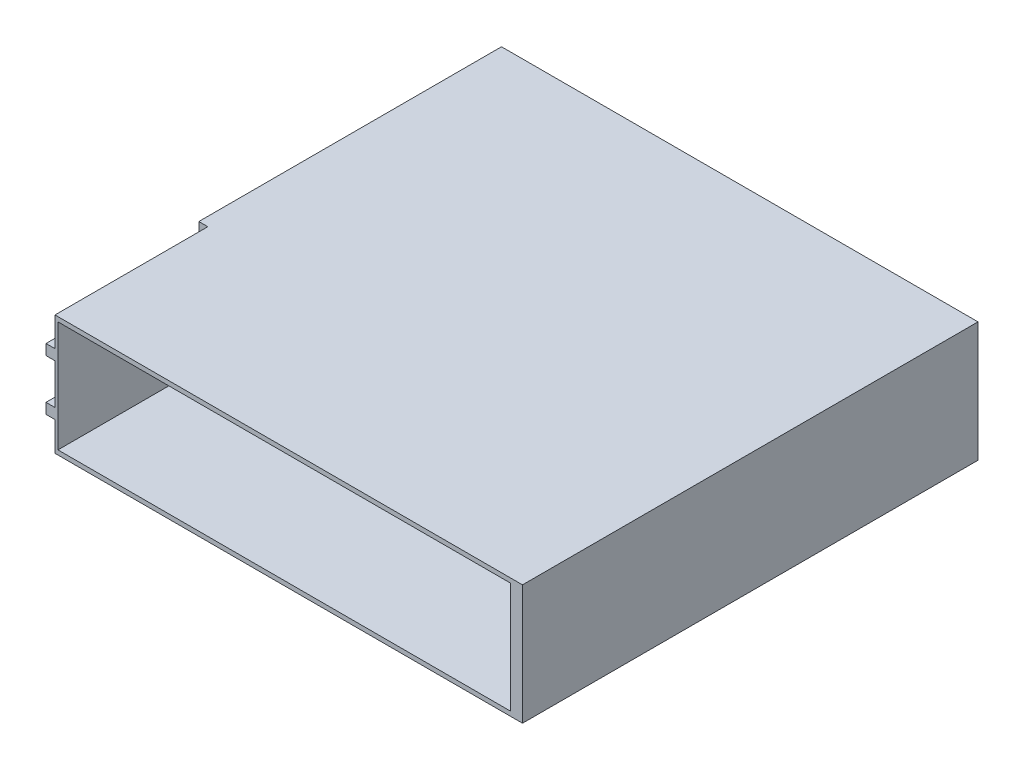
ISO-10303-21;
HEADER;
FILE_DESCRIPTION(('STEP AP214'),'2;1');
FILE_NAME('part.step','',(''),(''),'','','');
FILE_SCHEMA(('AUTOMOTIVE_DESIGN { 1 0 10303 214 1 1 1 1 }'));
ENDSEC;
DATA;
#1=APPLICATION_CONTEXT('core data for automotive mechanical design processes');
#2=APPLICATION_PROTOCOL_DEFINITION('international standard','automotive_design',2000,#1);
#3=PRODUCT_CONTEXT('',#1,'mechanical');
#4=PRODUCT('Part','Part','',(#3));
#5=PRODUCT_RELATED_PRODUCT_CATEGORY('part','',(#4));
#6=PRODUCT_DEFINITION_FORMATION('','',#4);
#7=PRODUCT_DEFINITION_CONTEXT('part definition',#1,'design');
#8=PRODUCT_DEFINITION('design','',#6,#7);
#9=PRODUCT_DEFINITION_SHAPE('','',#8);
#10=(LENGTH_UNIT() NAMED_UNIT(*) SI_UNIT(.MILLI.,.METRE.));
#11=(NAMED_UNIT(*) PLANE_ANGLE_UNIT() SI_UNIT($,.RADIAN.));
#12=(NAMED_UNIT(*) SI_UNIT($,.STERADIAN.) SOLID_ANGLE_UNIT());
#13=UNCERTAINTY_MEASURE_WITH_UNIT(LENGTH_MEASURE(1.E-05),#10,'distance_accuracy_value','');
#14=(GEOMETRIC_REPRESENTATION_CONTEXT(3) GLOBAL_UNCERTAINTY_ASSIGNED_CONTEXT((#13)) GLOBAL_UNIT_ASSIGNED_CONTEXT((#10,
#11,#12)) REPRESENTATION_CONTEXT('',''));
#15=CARTESIAN_POINT('',(0.,0.,0.));
#16=DIRECTION('',(0.,0.,1.));
#17=DIRECTION('',(1.,0.,0.));
#18=AXIS2_PLACEMENT_3D('',#15,#16,#17);
#19=CARTESIAN_POINT('',(0.,0.,2.));
#20=DIRECTION('',(1.,0.,0.));
#21=DIRECTION('',(0.,0.,-1.));
#22=AXIS2_PLACEMENT_3D('',#19,#20,#21);
#23=PLANE('',#22);
#24=DIRECTION('',(0.,0.,1.));
#25=VECTOR('',#24,1.);
#26=CARTESIAN_POINT('',(0.,9.74999999999999,0.));
#27=LINE('',#26,#25);
#28=CARTESIAN_POINT('',(0.,9.74999999999999,101.));
#29=VERTEX_POINT('',#28);
#30=CARTESIAN_POINT('',(0.,9.74999999999999,152.));
#31=VERTEX_POINT('',#30);
#32=EDGE_CURVE('E163',#29,#31,#27,.T.);
#33=ORIENTED_EDGE('',*,*,#32,.T.);
#34=DIRECTION('',(0.,-1.,0.));
#35=VECTOR('',#34,1.);
#36=CARTESIAN_POINT('',(0.,40.,152.));
#37=LINE('',#36,#35);
#38=CARTESIAN_POINT('',(0.,13.25,152.));
#39=VERTEX_POINT('',#38);
#40=EDGE_CURVE('E263',#39,#31,#37,.T.);
#41=ORIENTED_EDGE('',*,*,#40,.F.);
#42=DIRECTION('',(0.,0.,1.));
#43=VECTOR('',#42,1.);
#44=CARTESIAN_POINT('',(0.,13.25,0.));
#45=LINE('',#44,#43);
#46=CARTESIAN_POINT('',(0.,13.25,101.));
#47=VERTEX_POINT('',#46);
#48=EDGE_CURVE('E199',#47,#39,#45,.T.);
#49=ORIENTED_EDGE('',*,*,#48,.F.);
#50=DIRECTION('',(0.,-1.,0.));
#51=VECTOR('',#50,1.);
#52=CARTESIAN_POINT('',(0.,0.,101.));
#53=LINE('',#52,#51);
#54=CARTESIAN_POINT('',(0.,26.75,101.));
#55=VERTEX_POINT('',#54);
#56=EDGE_CURVE('E186',#55,#47,#53,.T.);
#57=ORIENTED_EDGE('',*,*,#56,.F.);
#58=DIRECTION('',(0.,0.,1.));
#59=VECTOR('',#58,1.);
#60=CARTESIAN_POINT('',(0.,26.75,0.));
#61=LINE('',#60,#59);
#62=CARTESIAN_POINT('',(0.,26.75,152.));
#63=VERTEX_POINT('',#62);
#64=EDGE_CURVE('E190',#55,#63,#61,.T.);
#65=ORIENTED_EDGE('',*,*,#64,.T.);
#66=CARTESIAN_POINT('',(0.,30.25,152.));
#67=VERTEX_POINT('',#66);
#68=EDGE_CURVE('E264',#67,#63,#37,.T.);
#69=ORIENTED_EDGE('',*,*,#68,.F.);
#70=DIRECTION('',(0.,0.,1.));
#71=VECTOR('',#70,1.);
#72=CARTESIAN_POINT('',(0.,30.25,0.));
#73=LINE('',#72,#71);
#74=CARTESIAN_POINT('',(0.,30.25,101.));
#75=VERTEX_POINT('',#74);
#76=EDGE_CURVE('E216',#75,#67,#73,.T.);
#77=ORIENTED_EDGE('',*,*,#76,.F.);
#78=DIRECTION('',(0.,-1.,0.));
#79=VECTOR('',#78,1.);
#80=CARTESIAN_POINT('',(0.,0.,101.));
#81=LINE('',#80,#79);
#82=CARTESIAN_POINT('',(0.,40.,101.));
#83=VERTEX_POINT('',#82);
#84=EDGE_CURVE('E205',#83,#75,#81,.T.);
#85=ORIENTED_EDGE('',*,*,#84,.F.);
#86=DIRECTION('',(0.,0.,-1.));
#87=VECTOR('',#86,1.);
#88=CARTESIAN_POINT('',(0.,40.,2.));
#89=LINE('',#88,#87);
#90=CARTESIAN_POINT('',(0.,40.,0.));
#91=VERTEX_POINT('',#90);
#92=EDGE_CURVE('E285',#83,#91,#89,.T.);
#93=ORIENTED_EDGE('',*,*,#92,.T.);
#94=DIRECTION('',(0.,-1.,0.));
#95=VECTOR('',#94,1.);
#96=CARTESIAN_POINT('',(0.,0.,0.));
#97=LINE('',#96,#95);
#98=CARTESIAN_POINT('',(0.,0.,0.));
#99=VERTEX_POINT('',#98);
#100=EDGE_CURVE('E275',#91,#99,#97,.T.);
#101=ORIENTED_EDGE('',*,*,#100,.T.);
#102=DIRECTION('',(0.,0.,-1.));
#103=VECTOR('',#102,1.);
#104=CARTESIAN_POINT('',(0.,0.,2.));
#105=LINE('',#104,#103);
#106=CARTESIAN_POINT('',(0.,0.,101.));
#107=VERTEX_POINT('',#106);
#108=EDGE_CURVE('E11',#107,#99,#105,.T.);
#109=ORIENTED_EDGE('',*,*,#108,.F.);
#110=DIRECTION('',(0.,-1.,0.));
#111=VECTOR('',#110,1.);
#112=CARTESIAN_POINT('',(0.,0.,101.));
#113=LINE('',#112,#111);
#114=EDGE_CURVE('E172',#29,#107,#113,.T.);
#115=ORIENTED_EDGE('',*,*,#114,.F.);
#116=EDGE_LOOP('',(#33,#41,#49,#57,#65,#69,#77,#85,#93,#101,#109,#115));
#117=FACE_BOUND('',#116,.T.);
#118=ADVANCED_FACE('F33',(#117),#23,.F.);
#119=CARTESIAN_POINT('',(0.,0.,152.));
#120=DIRECTION('',(0.,0.,1.));
#121=DIRECTION('',(1.,0.,0.));
#122=AXIS2_PLACEMENT_3D('',#119,#120,#121);
#123=PLANE('',#122);
#124=DIRECTION('',(1.,0.,0.));
#125=VECTOR('',#124,1.);
#126=CARTESIAN_POINT('',(4.,1.5,152.));
#127=LINE('',#126,#125);
#128=CARTESIAN_POINT('',(4.,1.5,152.));
#129=VERTEX_POINT('',#128);
#130=CARTESIAN_POINT('',(155.,1.5,152.));
#131=VERTEX_POINT('',#130);
#132=EDGE_CURVE('E236',#129,#131,#127,.T.);
#133=ORIENTED_EDGE('',*,*,#132,.F.);
#134=DIRECTION('',(0.,-1.,0.));
#135=VECTOR('',#134,1.);
#136=CARTESIAN_POINT('',(4.,38.5,152.));
#137=LINE('',#136,#135);
#138=CARTESIAN_POINT('',(4.,38.5,152.));
#139=VERTEX_POINT('',#138);
#140=EDGE_CURVE('E234',#139,#129,#137,.T.);
#141=ORIENTED_EDGE('',*,*,#140,.F.);
#142=DIRECTION('',(-1.,0.,0.));
#143=VECTOR('',#142,1.);
#144=CARTESIAN_POINT('',(4.,38.5,152.));
#145=LINE('',#144,#143);
#146=CARTESIAN_POINT('',(155.,38.5,152.));
#147=VERTEX_POINT('',#146);
#148=EDGE_CURVE('E242',#147,#139,#145,.T.);
#149=ORIENTED_EDGE('',*,*,#148,.F.);
#150=DIRECTION('',(0.,1.,0.));
#151=VECTOR('',#150,1.);
#152=CARTESIAN_POINT('',(155.,38.5,152.));
#153=LINE('',#152,#151);
#154=EDGE_CURVE('E239',#131,#147,#153,.T.);
#155=ORIENTED_EDGE('',*,*,#154,.F.);
#156=EDGE_LOOP('',(#133,#141,#149,#155));
#157=FACE_BOUND('',#156,.T.);
#158=ORIENTED_EDGE('',*,*,#40,.T.);
#159=DIRECTION('',(-1.,0.,0.));
#160=VECTOR('',#159,1.);
#161=CARTESIAN_POINT('',(3.,9.74999999999999,152.));
#162=LINE('',#161,#160);
#163=CARTESIAN_POINT('',(3.,9.74999999999999,152.));
#164=VERTEX_POINT('',#163);
#165=EDGE_CURVE('E184',#164,#31,#162,.T.);
#166=ORIENTED_EDGE('',*,*,#165,.F.);
#167=DIRECTION('',(0.,1.,0.));
#168=VECTOR('',#167,1.);
#169=CARTESIAN_POINT('',(3.,0.,152.));
#170=LINE('',#169,#168);
#171=CARTESIAN_POINT('',(3.,0.,152.));
#172=VERTEX_POINT('',#171);
#173=EDGE_CURVE('E167',#172,#164,#170,.T.);
#174=ORIENTED_EDGE('',*,*,#173,.F.);
#175=DIRECTION('',(1.,0.,0.));
#176=VECTOR('',#175,1.);
#177=CARTESIAN_POINT('',(0.,0.,152.));
#178=LINE('',#177,#176);
#179=CARTESIAN_POINT('',(159.,0.,152.));
#180=VERTEX_POINT('',#179);
#181=EDGE_CURVE('E267',#172,#180,#178,.T.);
#182=ORIENTED_EDGE('',*,*,#181,.T.);
#183=DIRECTION('',(0.,1.,0.));
#184=VECTOR('',#183,1.);
#185=CARTESIAN_POINT('',(159.,40.,152.));
#186=LINE('',#185,#184);
#187=CARTESIAN_POINT('',(159.,40.,152.));
#188=VERTEX_POINT('',#187);
#189=EDGE_CURVE('E269',#180,#188,#186,.T.);
#190=ORIENTED_EDGE('',*,*,#189,.T.);
#191=DIRECTION('',(-1.,0.,0.));
#192=VECTOR('',#191,1.);
#193=CARTESIAN_POINT('',(0.,40.,152.));
#194=LINE('',#193,#192);
#195=CARTESIAN_POINT('',(3.,40.,152.));
#196=VERTEX_POINT('',#195);
#197=EDGE_CURVE('E272',#188,#196,#194,.T.);
#198=ORIENTED_EDGE('',*,*,#197,.T.);
#199=DIRECTION('',(0.,1.,0.));
#200=VECTOR('',#199,1.);
#201=CARTESIAN_POINT('',(3.,0.,152.));
#202=LINE('',#201,#200);
#203=CARTESIAN_POINT('',(3.,30.25,152.));
#204=VERTEX_POINT('',#203);
#205=EDGE_CURVE('E218',#204,#196,#202,.T.);
#206=ORIENTED_EDGE('',*,*,#205,.F.);
#207=DIRECTION('',(-1.,0.,0.));
#208=VECTOR('',#207,1.);
#209=CARTESIAN_POINT('',(3.,30.25,152.));
#210=LINE('',#209,#208);
#211=EDGE_CURVE('E230',#204,#67,#210,.T.);
#212=ORIENTED_EDGE('',*,*,#211,.T.);
#213=ORIENTED_EDGE('',*,*,#68,.T.);
#214=DIRECTION('',(-1.,0.,0.));
#215=VECTOR('',#214,1.);
#216=CARTESIAN_POINT('',(3.,26.75,152.));
#217=LINE('',#216,#215);
#218=CARTESIAN_POINT('',(3.,26.75,152.));
#219=VERTEX_POINT('',#218);
#220=EDGE_CURVE('E206',#219,#63,#217,.T.);
#221=ORIENTED_EDGE('',*,*,#220,.F.);
#222=DIRECTION('',(0.,1.,0.));
#223=VECTOR('',#222,1.);
#224=CARTESIAN_POINT('',(3.,0.,152.));
#225=LINE('',#224,#223);
#226=CARTESIAN_POINT('',(3.,13.25,152.));
#227=VERTEX_POINT('',#226);
#228=EDGE_CURVE('E192',#227,#219,#225,.T.);
#229=ORIENTED_EDGE('',*,*,#228,.F.);
#230=DIRECTION('',(-1.,0.,0.));
#231=VECTOR('',#230,1.);
#232=CARTESIAN_POINT('',(3.,13.25,152.));
#233=LINE('',#232,#231);
#234=EDGE_CURVE('E208',#227,#39,#233,.T.);
#235=ORIENTED_EDGE('',*,*,#234,.T.);
#236=EDGE_LOOP('',(#158,#166,#174,#182,#190,#198,#206,#212,#213,#221,#229,#235));
#237=FACE_BOUND('',#236,.T.);
#238=ADVANCED_FACE('F310',(#157,#237),#123,.T.);
#239=CARTESIAN_POINT('',(0.,0.,2.));
#240=DIRECTION('',(0.,1.,0.));
#241=DIRECTION('',(0.,0.,1.));
#242=AXIS2_PLACEMENT_3D('',#239,#240,#241);
#243=PLANE('',#242);
#244=DIRECTION('',(0.,0.,1.));
#245=VECTOR('',#244,1.);
#246=CARTESIAN_POINT('',(3.,0.,0.));
#247=LINE('',#246,#245);
#248=CARTESIAN_POINT('',(3.,0.,101.));
#249=VERTEX_POINT('',#248);
#250=EDGE_CURVE('E177',#249,#172,#247,.T.);
#251=ORIENTED_EDGE('',*,*,#250,.F.);
#252=DIRECTION('',(-1.,0.,0.));
#253=VECTOR('',#252,1.);
#254=CARTESIAN_POINT('',(3.,0.,101.));
#255=LINE('',#254,#253);
#256=EDGE_CURVE('E166',#249,#107,#255,.T.);
#257=ORIENTED_EDGE('',*,*,#256,.T.);
#258=ORIENTED_EDGE('',*,*,#108,.T.);
#259=DIRECTION('',(1.,0.,0.));
#260=VECTOR('',#259,1.);
#261=CARTESIAN_POINT('',(0.,0.,0.));
#262=LINE('',#261,#260);
#263=CARTESIAN_POINT('',(159.,0.,0.));
#264=VERTEX_POINT('',#263);
#265=EDGE_CURVE('E278',#99,#264,#262,.T.);
#266=ORIENTED_EDGE('',*,*,#265,.T.);
#267=DIRECTION('',(0.,0.,-1.));
#268=VECTOR('',#267,1.);
#269=CARTESIAN_POINT('',(159.,0.,2.));
#270=LINE('',#269,#268);
#271=EDGE_CURVE('E40',#180,#264,#270,.T.);
#272=ORIENTED_EDGE('',*,*,#271,.F.);
#273=ORIENTED_EDGE('',*,*,#181,.F.);
#274=EDGE_LOOP('',(#251,#257,#258,#266,#272,#273));
#275=FACE_BOUND('',#274,.T.);
#276=ADVANCED_FACE('F312',(#275),#243,.F.);
#277=CARTESIAN_POINT('',(159.,0.,2.));
#278=DIRECTION('',(-1.,0.,0.));
#279=DIRECTION('',(0.,0.,1.));
#280=AXIS2_PLACEMENT_3D('',#277,#278,#279);
#281=PLANE('',#280);
#282=DIRECTION('',(0.,1.,0.));
#283=VECTOR('',#282,1.);
#284=CARTESIAN_POINT('',(159.,0.,0.));
#285=LINE('',#284,#283);
#286=CARTESIAN_POINT('',(159.,40.,0.));
#287=VERTEX_POINT('',#286);
#288=EDGE_CURVE('E280',#264,#287,#285,.T.);
#289=ORIENTED_EDGE('',*,*,#288,.T.);
#290=DIRECTION('',(0.,0.,-1.));
#291=VECTOR('',#290,1.);
#292=CARTESIAN_POINT('',(159.,40.,2.));
#293=LINE('',#292,#291);
#294=EDGE_CURVE('E287',#188,#287,#293,.T.);
#295=ORIENTED_EDGE('',*,*,#294,.F.);
#296=ORIENTED_EDGE('',*,*,#189,.F.);
#297=ORIENTED_EDGE('',*,*,#271,.T.);
#298=EDGE_LOOP('',(#289,#295,#296,#297));
#299=FACE_BOUND('',#298,.T.);
#300=ADVANCED_FACE('F294',(#299),#281,.F.);
#301=CARTESIAN_POINT('',(0.,40.,2.));
#302=DIRECTION('',(0.,-1.,0.));
#303=DIRECTION('',(0.,0.,-1.));
#304=AXIS2_PLACEMENT_3D('',#301,#302,#303);
#305=PLANE('',#304);
#306=ORIENTED_EDGE('',*,*,#92,.F.);
#307=DIRECTION('',(-1.,0.,0.));
#308=VECTOR('',#307,1.);
#309=CARTESIAN_POINT('',(3.,40.,101.));
#310=LINE('',#309,#308);
#311=CARTESIAN_POINT('',(3.,40.,101.));
#312=VERTEX_POINT('',#311);
#313=EDGE_CURVE('E227',#312,#83,#310,.T.);
#314=ORIENTED_EDGE('',*,*,#313,.F.);
#315=DIRECTION('',(0.,0.,-1.));
#316=VECTOR('',#315,1.);
#317=CARTESIAN_POINT('',(3.,40.,0.));
#318=LINE('',#317,#316);
#319=EDGE_CURVE('E220',#196,#312,#318,.T.);
#320=ORIENTED_EDGE('',*,*,#319,.F.);
#321=ORIENTED_EDGE('',*,*,#197,.F.);
#322=ORIENTED_EDGE('',*,*,#294,.T.);
#323=DIRECTION('',(-1.,0.,0.));
#324=VECTOR('',#323,1.);
#325=CARTESIAN_POINT('',(0.,40.,0.));
#326=LINE('',#325,#324);
#327=EDGE_CURVE('E282',#287,#91,#326,.T.);
#328=ORIENTED_EDGE('',*,*,#327,.T.);
#329=EDGE_LOOP('',(#306,#314,#320,#321,#322,#328));
#330=FACE_BOUND('',#329,.T.);
#331=ADVANCED_FACE('F304',(#330),#305,.F.);
#332=CARTESIAN_POINT('',(0.,0.,0.));
#333=DIRECTION('',(0.,0.,-1.));
#334=DIRECTION('',(-1.,0.,0.));
#335=AXIS2_PLACEMENT_3D('',#332,#333,#334);
#336=PLANE('',#335);
#337=ORIENTED_EDGE('',*,*,#100,.F.);
#338=ORIENTED_EDGE('',*,*,#327,.F.);
#339=ORIENTED_EDGE('',*,*,#288,.F.);
#340=ORIENTED_EDGE('',*,*,#265,.F.);
#341=EDGE_LOOP('',(#337,#338,#339,#340));
#342=FACE_BOUND('',#341,.T.);
#343=ADVANCED_FACE('F301',(#342),#336,.T.);
#344=CARTESIAN_POINT('',(4.,38.5,152.));
#345=DIRECTION('',(1.,0.,0.));
#346=DIRECTION('',(0.,1.,0.));
#347=AXIS2_PLACEMENT_3D('',#344,#345,#346);
#348=PLANE('',#347);
#349=DIRECTION('',(0.,-1.,0.));
#350=VECTOR('',#349,1.);
#351=CARTESIAN_POINT('',(4.,38.5,2.));
#352=LINE('',#351,#350);
#353=CARTESIAN_POINT('',(4.,38.5,2.));
#354=VERTEX_POINT('',#353);
#355=CARTESIAN_POINT('',(4.,1.5,2.));
#356=VERTEX_POINT('',#355);
#357=EDGE_CURVE('E229',#354,#356,#352,.T.);
#358=ORIENTED_EDGE('',*,*,#357,.F.);
#359=DIRECTION('',(0.,0.,-1.));
#360=VECTOR('',#359,1.);
#361=CARTESIAN_POINT('',(4.,38.5,152.));
#362=LINE('',#361,#360);
#363=EDGE_CURVE('E244',#139,#354,#362,.T.);
#364=ORIENTED_EDGE('',*,*,#363,.F.);
#365=ORIENTED_EDGE('',*,*,#140,.T.);
#366=DIRECTION('',(0.,0.,-1.));
#367=VECTOR('',#366,1.);
#368=CARTESIAN_POINT('',(4.,1.5,152.));
#369=LINE('',#368,#367);
#370=EDGE_CURVE('E260',#129,#356,#369,.T.);
#371=ORIENTED_EDGE('',*,*,#370,.T.);
#372=EDGE_LOOP('',(#358,#364,#365,#371));
#373=FACE_BOUND('',#372,.T.);
#374=ADVANCED_FACE('F361',(#373),#348,.T.);
#375=CARTESIAN_POINT('',(4.,1.5,152.));
#376=DIRECTION('',(0.,1.,0.));
#377=DIRECTION('',(0.,0.,1.));
#378=AXIS2_PLACEMENT_3D('',#375,#376,#377);
#379=PLANE('',#378);
#380=DIRECTION('',(1.,0.,0.));
#381=VECTOR('',#380,1.);
#382=CARTESIAN_POINT('',(4.,1.5,2.));
#383=LINE('',#382,#381);
#384=CARTESIAN_POINT('',(155.,1.5,2.));
#385=VERTEX_POINT('',#384);
#386=EDGE_CURVE('E247',#356,#385,#383,.T.);
#387=ORIENTED_EDGE('',*,*,#386,.F.);
#388=ORIENTED_EDGE('',*,*,#370,.F.);
#389=ORIENTED_EDGE('',*,*,#132,.T.);
#390=DIRECTION('',(0.,0.,-1.));
#391=VECTOR('',#390,1.);
#392=CARTESIAN_POINT('',(155.,1.5,152.));
#393=LINE('',#392,#391);
#394=EDGE_CURVE('E258',#131,#385,#393,.T.);
#395=ORIENTED_EDGE('',*,*,#394,.T.);
#396=EDGE_LOOP('',(#387,#388,#389,#395));
#397=FACE_BOUND('',#396,.T.);
#398=ADVANCED_FACE('F392',(#397),#379,.T.);
#399=CARTESIAN_POINT('',(155.,38.5,152.));
#400=DIRECTION('',(-1.,0.,0.));
#401=DIRECTION('',(0.,0.,1.));
#402=AXIS2_PLACEMENT_3D('',#399,#400,#401);
#403=PLANE('',#402);
#404=DIRECTION('',(0.,1.,0.));
#405=VECTOR('',#404,1.);
#406=CARTESIAN_POINT('',(155.,38.5,2.));
#407=LINE('',#406,#405);
#408=CARTESIAN_POINT('',(155.,38.5,2.));
#409=VERTEX_POINT('',#408);
#410=EDGE_CURVE('E250',#385,#409,#407,.T.);
#411=ORIENTED_EDGE('',*,*,#410,.F.);
#412=ORIENTED_EDGE('',*,*,#394,.F.);
#413=ORIENTED_EDGE('',*,*,#154,.T.);
#414=DIRECTION('',(0.,0.,-1.));
#415=VECTOR('',#414,1.);
#416=CARTESIAN_POINT('',(155.,38.5,152.));
#417=LINE('',#416,#415);
#418=EDGE_CURVE('E256',#147,#409,#417,.T.);
#419=ORIENTED_EDGE('',*,*,#418,.T.);
#420=EDGE_LOOP('',(#411,#412,#413,#419));
#421=FACE_BOUND('',#420,.T.);
#422=ADVANCED_FACE('F399',(#421),#403,.T.);
#423=CARTESIAN_POINT('',(4.,38.5,152.));
#424=DIRECTION('',(0.,-1.,0.));
#425=DIRECTION('',(0.,0.,-1.));
#426=AXIS2_PLACEMENT_3D('',#423,#424,#425);
#427=PLANE('',#426);
#428=DIRECTION('',(-1.,0.,0.));
#429=VECTOR('',#428,1.);
#430=CARTESIAN_POINT('',(4.,38.5,2.));
#431=LINE('',#430,#429);
#432=EDGE_CURVE('E237',#409,#354,#431,.T.);
#433=ORIENTED_EDGE('',*,*,#432,.F.);
#434=ORIENTED_EDGE('',*,*,#418,.F.);
#435=ORIENTED_EDGE('',*,*,#148,.T.);
#436=ORIENTED_EDGE('',*,*,#363,.T.);
#437=EDGE_LOOP('',(#433,#434,#435,#436));
#438=FACE_BOUND('',#437,.T.);
#439=ADVANCED_FACE('F366',(#438),#427,.T.);
#440=CARTESIAN_POINT('',(0.,0.,2.));
#441=DIRECTION('',(0.,0.,-1.));
#442=DIRECTION('',(-1.,0.,0.));
#443=AXIS2_PLACEMENT_3D('',#440,#441,#442);
#444=PLANE('',#443);
#445=ORIENTED_EDGE('',*,*,#432,.T.);
#446=ORIENTED_EDGE('',*,*,#357,.T.);
#447=ORIENTED_EDGE('',*,*,#386,.T.);
#448=ORIENTED_EDGE('',*,*,#410,.T.);
#449=EDGE_LOOP('',(#445,#446,#447,#448));
#450=FACE_BOUND('',#449,.T.);
#451=ADVANCED_FACE('F363',(#450),#444,.F.);
#452=CARTESIAN_POINT('',(3.,0.,101.));
#453=DIRECTION('',(0.,0.,-1.));
#454=DIRECTION('',(-1.,0.,0.));
#455=AXIS2_PLACEMENT_3D('',#452,#453,#454);
#456=PLANE('',#455);
#457=ORIENTED_EDGE('',*,*,#84,.T.);
#458=DIRECTION('',(-1.,0.,0.));
#459=VECTOR('',#458,1.);
#460=CARTESIAN_POINT('',(3.,30.25,101.));
#461=LINE('',#460,#459);
#462=CARTESIAN_POINT('',(3.,30.25,101.));
#463=VERTEX_POINT('',#462);
#464=EDGE_CURVE('E223',#463,#75,#461,.T.);
#465=ORIENTED_EDGE('',*,*,#464,.F.);
#466=DIRECTION('',(0.,-1.,0.));
#467=VECTOR('',#466,1.);
#468=CARTESIAN_POINT('',(3.,0.,101.));
#469=LINE('',#468,#467);
#470=EDGE_CURVE('E212',#312,#463,#469,.T.);
#471=ORIENTED_EDGE('',*,*,#470,.F.);
#472=ORIENTED_EDGE('',*,*,#313,.T.);
#473=EDGE_LOOP('',(#457,#465,#471,#472));
#474=FACE_BOUND('',#473,.T.);
#475=ADVANCED_FACE('F319',(#474),#456,.F.);
#476=CARTESIAN_POINT('',(3.,30.25,0.));
#477=DIRECTION('',(0.,-1.,0.));
#478=DIRECTION('',(0.,0.,-1.));
#479=AXIS2_PLACEMENT_3D('',#476,#477,#478);
#480=PLANE('',#479);
#481=ORIENTED_EDGE('',*,*,#76,.T.);
#482=ORIENTED_EDGE('',*,*,#211,.F.);
#483=DIRECTION('',(0.,0.,1.));
#484=VECTOR('',#483,1.);
#485=CARTESIAN_POINT('',(3.,30.25,0.));
#486=LINE('',#485,#484);
#487=EDGE_CURVE('E215',#463,#204,#486,.T.);
#488=ORIENTED_EDGE('',*,*,#487,.F.);
#489=ORIENTED_EDGE('',*,*,#464,.T.);
#490=EDGE_LOOP('',(#481,#482,#488,#489));
#491=FACE_BOUND('',#490,.T.);
#492=ADVANCED_FACE('F423',(#491),#480,.F.);
#493=CARTESIAN_POINT('',(3.,0.,0.));
#494=DIRECTION('',(-1.,0.,0.));
#495=DIRECTION('',(0.,0.,1.));
#496=AXIS2_PLACEMENT_3D('',#493,#494,#495);
#497=PLANE('',#496);
#498=ORIENTED_EDGE('',*,*,#470,.T.);
#499=ORIENTED_EDGE('',*,*,#487,.T.);
#500=ORIENTED_EDGE('',*,*,#205,.T.);
#501=ORIENTED_EDGE('',*,*,#319,.T.);
#502=EDGE_LOOP('',(#498,#499,#500,#501));
#503=FACE_BOUND('',#502,.T.);
#504=ADVANCED_FACE('F322',(#503),#497,.T.);
#505=CARTESIAN_POINT('',(3.,0.,101.));
#506=DIRECTION('',(0.,0.,-1.));
#507=DIRECTION('',(-1.,0.,0.));
#508=AXIS2_PLACEMENT_3D('',#505,#506,#507);
#509=PLANE('',#508);
#510=ORIENTED_EDGE('',*,*,#56,.T.);
#511=DIRECTION('',(-1.,0.,0.));
#512=VECTOR('',#511,1.);
#513=CARTESIAN_POINT('',(3.,13.25,101.));
#514=LINE('',#513,#512);
#515=CARTESIAN_POINT('',(3.,13.25,101.));
#516=VERTEX_POINT('',#515);
#517=EDGE_CURVE('E196',#516,#47,#514,.T.);
#518=ORIENTED_EDGE('',*,*,#517,.F.);
#519=DIRECTION('',(0.,-1.,0.));
#520=VECTOR('',#519,1.);
#521=CARTESIAN_POINT('',(3.,0.,101.));
#522=LINE('',#521,#520);
#523=CARTESIAN_POINT('',(3.,26.75,101.));
#524=VERTEX_POINT('',#523);
#525=EDGE_CURVE('E188',#524,#516,#522,.T.);
#526=ORIENTED_EDGE('',*,*,#525,.F.);
#527=DIRECTION('',(-1.,0.,0.));
#528=VECTOR('',#527,1.);
#529=CARTESIAN_POINT('',(3.,26.75,101.));
#530=LINE('',#529,#528);
#531=EDGE_CURVE('E203',#524,#55,#530,.T.);
#532=ORIENTED_EDGE('',*,*,#531,.T.);
#533=EDGE_LOOP('',(#510,#518,#526,#532));
#534=FACE_BOUND('',#533,.T.);
#535=ADVANCED_FACE('F337',(#534),#509,.F.);
#536=CARTESIAN_POINT('',(3.,26.75,0.));
#537=DIRECTION('',(0.,-1.,0.));
#538=DIRECTION('',(0.,0.,-1.));
#539=AXIS2_PLACEMENT_3D('',#536,#537,#538);
#540=PLANE('',#539);
#541=ORIENTED_EDGE('',*,*,#64,.F.);
#542=ORIENTED_EDGE('',*,*,#531,.F.);
#543=DIRECTION('',(0.,0.,1.));
#544=VECTOR('',#543,1.);
#545=CARTESIAN_POINT('',(3.,26.75,0.));
#546=LINE('',#545,#544);
#547=EDGE_CURVE('E194',#524,#219,#546,.T.);
#548=ORIENTED_EDGE('',*,*,#547,.T.);
#549=ORIENTED_EDGE('',*,*,#220,.T.);
#550=EDGE_LOOP('',(#541,#542,#548,#549));
#551=FACE_BOUND('',#550,.T.);
#552=ADVANCED_FACE('F330',(#551),#540,.T.);
#553=CARTESIAN_POINT('',(3.,13.25,0.));
#554=DIRECTION('',(0.,-1.,0.));
#555=DIRECTION('',(0.,0.,-1.));
#556=AXIS2_PLACEMENT_3D('',#553,#554,#555);
#557=PLANE('',#556);
#558=ORIENTED_EDGE('',*,*,#48,.T.);
#559=ORIENTED_EDGE('',*,*,#234,.F.);
#560=DIRECTION('',(0.,0.,1.));
#561=VECTOR('',#560,1.);
#562=CARTESIAN_POINT('',(3.,13.25,0.));
#563=LINE('',#562,#561);
#564=EDGE_CURVE('E55',#516,#227,#563,.T.);
#565=ORIENTED_EDGE('',*,*,#564,.F.);
#566=ORIENTED_EDGE('',*,*,#517,.T.);
#567=EDGE_LOOP('',(#558,#559,#565,#566));
#568=FACE_BOUND('',#567,.T.);
#569=ADVANCED_FACE('F339',(#568),#557,.F.);
#570=CARTESIAN_POINT('',(3.,0.,0.));
#571=DIRECTION('',(-1.,0.,0.));
#572=DIRECTION('',(0.,0.,1.));
#573=AXIS2_PLACEMENT_3D('',#570,#571,#572);
#574=PLANE('',#573);
#575=ORIENTED_EDGE('',*,*,#525,.T.);
#576=ORIENTED_EDGE('',*,*,#564,.T.);
#577=ORIENTED_EDGE('',*,*,#228,.T.);
#578=ORIENTED_EDGE('',*,*,#547,.F.);
#579=EDGE_LOOP('',(#575,#576,#577,#578));
#580=FACE_BOUND('',#579,.T.);
#581=ADVANCED_FACE('F334',(#580),#574,.T.);
#582=CARTESIAN_POINT('',(3.,9.74999999999999,0.));
#583=DIRECTION('',(0.,-1.,0.));
#584=DIRECTION('',(0.,0.,-1.));
#585=AXIS2_PLACEMENT_3D('',#582,#583,#584);
#586=PLANE('',#585);
#587=ORIENTED_EDGE('',*,*,#32,.F.);
#588=DIRECTION('',(-1.,0.,0.));
#589=VECTOR('',#588,1.);
#590=CARTESIAN_POINT('',(3.,9.74999999999999,101.));
#591=LINE('',#590,#589);
#592=CARTESIAN_POINT('',(3.,9.74999999999999,101.));
#593=VERTEX_POINT('',#592);
#594=EDGE_CURVE('E158',#593,#29,#591,.T.);
#595=ORIENTED_EDGE('',*,*,#594,.F.);
#596=DIRECTION('',(0.,0.,1.));
#597=VECTOR('',#596,1.);
#598=CARTESIAN_POINT('',(3.,9.74999999999999,0.));
#599=LINE('',#598,#597);
#600=EDGE_CURVE('E160',#593,#164,#599,.T.);
#601=ORIENTED_EDGE('',*,*,#600,.T.);
#602=ORIENTED_EDGE('',*,*,#165,.T.);
#603=EDGE_LOOP('',(#587,#595,#601,#602));
#604=FACE_BOUND('',#603,.T.);
#605=ADVANCED_FACE('F159',(#604),#586,.T.);
#606=CARTESIAN_POINT('',(3.,0.,101.));
#607=DIRECTION('',(0.,0.,-1.));
#608=DIRECTION('',(-1.,0.,0.));
#609=AXIS2_PLACEMENT_3D('',#606,#607,#608);
#610=PLANE('',#609);
#611=ORIENTED_EDGE('',*,*,#114,.T.);
#612=ORIENTED_EDGE('',*,*,#256,.F.);
#613=DIRECTION('',(0.,-1.,0.));
#614=VECTOR('',#613,1.);
#615=CARTESIAN_POINT('',(3.,0.,101.));
#616=LINE('',#615,#614);
#617=EDGE_CURVE('E47',#593,#249,#616,.T.);
#618=ORIENTED_EDGE('',*,*,#617,.F.);
#619=ORIENTED_EDGE('',*,*,#594,.T.);
#620=EDGE_LOOP('',(#611,#612,#618,#619));
#621=FACE_BOUND('',#620,.T.);
#622=ADVANCED_FACE('F174',(#621),#610,.F.);
#623=CARTESIAN_POINT('',(3.,0.,0.));
#624=DIRECTION('',(-1.,0.,0.));
#625=DIRECTION('',(0.,0.,1.));
#626=AXIS2_PLACEMENT_3D('',#623,#624,#625);
#627=PLANE('',#626);
#628=ORIENTED_EDGE('',*,*,#600,.F.);
#629=ORIENTED_EDGE('',*,*,#617,.T.);
#630=ORIENTED_EDGE('',*,*,#250,.T.);
#631=ORIENTED_EDGE('',*,*,#173,.T.);
#632=EDGE_LOOP('',(#628,#629,#630,#631));
#633=FACE_BOUND('',#632,.T.);
#634=ADVANCED_FACE('F169',(#633),#627,.T.);
#635=CLOSED_SHELL('',(#118,#238,#276,#300,#331,#343,#374,#398,#422,#439,#451,#475,#492,#504,
#535,#552,#569,#581,#605,#622,#634));
#636=MANIFOLD_SOLID_BREP('B2',#635);
#637=ADVANCED_BREP_SHAPE_REPRESENTATION('',(#18,#636),#14);
#638=SHAPE_DEFINITION_REPRESENTATION(#9,#637);
ENDSEC;
END-ISO-10303-21;
